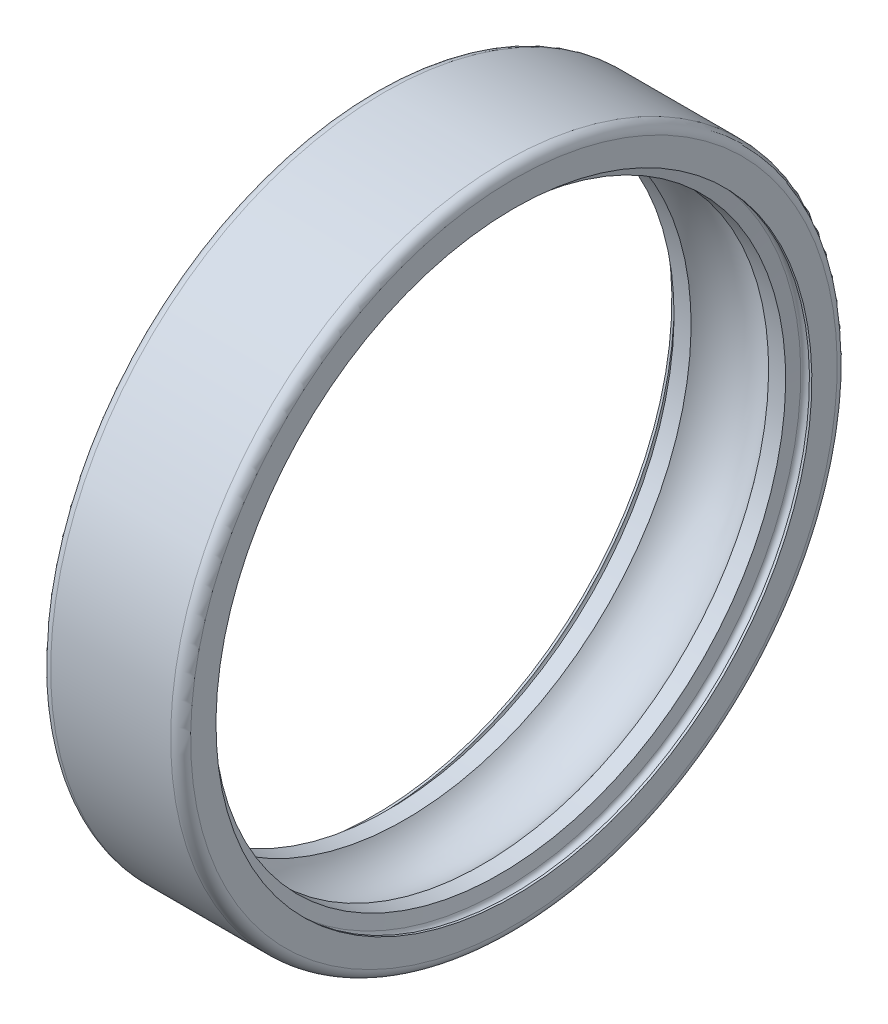
ISO-10303-21;
HEADER;
FILE_DESCRIPTION(('STEP AP214'),'2;1');
FILE_NAME('part.step','',(''),(''),'','','');
FILE_SCHEMA(('AUTOMOTIVE_DESIGN { 1 0 10303 214 1 1 1 1 }'));
ENDSEC;
DATA;
#1=APPLICATION_CONTEXT('core data for automotive mechanical design processes');
#2=APPLICATION_PROTOCOL_DEFINITION('international standard','automotive_design',2000,#1);
#3=PRODUCT_CONTEXT('',#1,'mechanical');
#4=PRODUCT('Part','Part','',(#3));
#5=PRODUCT_RELATED_PRODUCT_CATEGORY('part','',(#4));
#6=PRODUCT_DEFINITION_FORMATION('','',#4);
#7=PRODUCT_DEFINITION_CONTEXT('part definition',#1,'design');
#8=PRODUCT_DEFINITION('design','',#6,#7);
#9=PRODUCT_DEFINITION_SHAPE('','',#8);
#10=(LENGTH_UNIT() NAMED_UNIT(*) SI_UNIT(.MILLI.,.METRE.));
#11=(NAMED_UNIT(*) PLANE_ANGLE_UNIT() SI_UNIT($,.RADIAN.));
#12=(NAMED_UNIT(*) SI_UNIT($,.STERADIAN.) SOLID_ANGLE_UNIT());
#13=UNCERTAINTY_MEASURE_WITH_UNIT(LENGTH_MEASURE(1.E-05),#10,'distance_accuracy_value','');
#14=(GEOMETRIC_REPRESENTATION_CONTEXT(3) GLOBAL_UNCERTAINTY_ASSIGNED_CONTEXT((#13)) GLOBAL_UNIT_ASSIGNED_CONTEXT((#10,
#11,#12)) REPRESENTATION_CONTEXT('',''));
#15=CARTESIAN_POINT('',(0.,0.,0.));
#16=DIRECTION('',(0.,0.,1.));
#17=DIRECTION('',(1.,0.,0.));
#18=AXIS2_PLACEMENT_3D('',#15,#16,#17);
#19=CARTESIAN_POINT('',(19.92,0.,0.));
#20=DIRECTION('',(1.,0.,0.));
#21=DIRECTION('',(0.,0.,-1.));
#22=AXIS2_PLACEMENT_3D('',#19,#20,#21);
#23=TOROIDAL_SURFACE('',#22,44.7,0.72);
#24=CARTESIAN_POINT('',(20.64,0.,0.));
#25=DIRECTION('',(1.,0.,0.));
#26=DIRECTION('',(0.,1.,0.));
#27=AXIS2_PLACEMENT_3D('',#24,#25,#26);
#28=CIRCLE('',#27,44.7);
#29=CARTESIAN_POINT('',(20.64,44.7,0.));
#30=VERTEX_POINT('',#29);
#31=EDGE_CURVE('E11',#30,#30,#28,.T.);
#32=ORIENTED_EDGE('',*,*,#31,.T.);
#33=EDGE_LOOP('',(#32));
#34=FACE_BOUND('',#33,.T.);
#35=CARTESIAN_POINT('',(19.2109384178312,0.,0.));
#36=DIRECTION('',(1.,0.,0.));
#37=DIRECTION('',(0.,1.,0.));
#38=AXIS2_PLACEMENT_3D('',#35,#36,#37);
#39=CIRCLE('',#38,44.8250266879202);
#40=CARTESIAN_POINT('',(19.2109384178312,44.8250266879202,0.));
#41=VERTEX_POINT('',#40);
#42=EDGE_CURVE('E66',#41,#41,#39,.T.);
#43=ORIENTED_EDGE('',*,*,#42,.F.);
#44=EDGE_LOOP('',(#43));
#45=FACE_BOUND('',#44,.T.);
#46=ADVANCED_FACE('F16',(#34,#45),#23,.F.);
#47=CARTESIAN_POINT('',(20.82,0.,0.));
#48=DIRECTION('',(-1.,0.,0.));
#49=DIRECTION('',(0.,1.,0.));
#50=AXIS2_PLACEMENT_3D('',#47,#48,#49);
#51=CYLINDRICAL_SURFACE('',#50,44.7);
#52=CARTESIAN_POINT('',(21.,0.,0.));
#53=DIRECTION('',(1.,0.,0.));
#54=DIRECTION('',(0.,1.,0.));
#55=AXIS2_PLACEMENT_3D('',#52,#53,#54);
#56=CIRCLE('',#55,44.7);
#57=CARTESIAN_POINT('',(21.,44.7,0.));
#58=VERTEX_POINT('',#57);
#59=EDGE_CURVE('E26',#58,#58,#56,.T.);
#60=ORIENTED_EDGE('',*,*,#59,.T.);
#61=EDGE_LOOP('',(#60));
#62=FACE_BOUND('',#61,.T.);
#63=ORIENTED_EDGE('',*,*,#31,.F.);
#64=EDGE_LOOP('',(#63));
#65=FACE_BOUND('',#64,.T.);
#66=ADVANCED_FACE('F106',(#62,#65),#51,.F.);
#67=CARTESIAN_POINT('',(21.,46.6,0.));
#68=DIRECTION('',(1.,0.,0.));
#69=DIRECTION('',(0.,1.,0.));
#70=AXIS2_PLACEMENT_3D('',#67,#68,#69);
#71=PLANE('',#70);
#72=CARTESIAN_POINT('',(21.,0.,0.));
#73=DIRECTION('',(1.,0.,0.));
#74=DIRECTION('',(0.,1.,0.));
#75=AXIS2_PLACEMENT_3D('',#72,#73,#74);
#76=CIRCLE('',#75,48.5);
#77=CARTESIAN_POINT('',(21.,48.5,0.));
#78=VERTEX_POINT('',#77);
#79=EDGE_CURVE('E98',#78,#78,#76,.T.);
#80=ORIENTED_EDGE('',*,*,#79,.T.);
#81=EDGE_LOOP('',(#80));
#82=FACE_BOUND('',#81,.T.);
#83=ORIENTED_EDGE('',*,*,#59,.F.);
#84=EDGE_LOOP('',(#83));
#85=FACE_BOUND('',#84,.T.);
#86=ADVANCED_FACE('F109',(#82,#85),#71,.T.);
#87=CARTESIAN_POINT('',(19.5,0.,0.));
#88=DIRECTION('',(1.,0.,0.));
#89=DIRECTION('',(0.,0.,-1.));
#90=AXIS2_PLACEMENT_3D('',#87,#88,#89);
#91=TOROIDAL_SURFACE('',#90,48.5,1.5);
#92=CARTESIAN_POINT('',(19.5,0.,0.));
#93=DIRECTION('',(1.,0.,0.));
#94=DIRECTION('',(0.,1.,0.));
#95=AXIS2_PLACEMENT_3D('',#92,#93,#94);
#96=CIRCLE('',#95,50.);
#97=CARTESIAN_POINT('',(19.5,50.,0.));
#98=VERTEX_POINT('',#97);
#99=EDGE_CURVE('E96',#98,#98,#96,.T.);
#100=ORIENTED_EDGE('',*,*,#99,.T.);
#101=EDGE_LOOP('',(#100));
#102=FACE_BOUND('',#101,.T.);
#103=ORIENTED_EDGE('',*,*,#79,.F.);
#104=EDGE_LOOP('',(#103));
#105=FACE_BOUND('',#104,.T.);
#106=ADVANCED_FACE('F111',(#102,#105),#91,.T.);
#107=CARTESIAN_POINT('',(10.5,0.,0.));
#108=DIRECTION('',(-1.,0.,0.));
#109=DIRECTION('',(0.,1.,0.));
#110=AXIS2_PLACEMENT_3D('',#107,#108,#109);
#111=CYLINDRICAL_SURFACE('',#110,50.);
#112=CARTESIAN_POINT('',(1.5,0.,0.));
#113=DIRECTION('',(1.,0.,0.));
#114=DIRECTION('',(0.,1.,0.));
#115=AXIS2_PLACEMENT_3D('',#112,#113,#114);
#116=CIRCLE('',#115,50.);
#117=CARTESIAN_POINT('',(1.5,50.,0.));
#118=VERTEX_POINT('',#117);
#119=EDGE_CURVE('E93',#118,#118,#116,.T.);
#120=ORIENTED_EDGE('',*,*,#119,.T.);
#121=EDGE_LOOP('',(#120));
#122=FACE_BOUND('',#121,.T.);
#123=ORIENTED_EDGE('',*,*,#99,.F.);
#124=EDGE_LOOP('',(#123));
#125=FACE_BOUND('',#124,.T.);
#126=ADVANCED_FACE('F119',(#122,#125),#111,.T.);
#127=CARTESIAN_POINT('',(1.5,0.,0.));
#128=DIRECTION('',(1.,0.,0.));
#129=DIRECTION('',(0.,0.,-1.));
#130=AXIS2_PLACEMENT_3D('',#127,#128,#129);
#131=TOROIDAL_SURFACE('',#130,48.5,1.5);
#132=CARTESIAN_POINT('',(0.,0.,0.));
#133=DIRECTION('',(1.,0.,0.));
#134=DIRECTION('',(0.,1.,0.));
#135=AXIS2_PLACEMENT_3D('',#132,#133,#134);
#136=CIRCLE('',#135,48.5);
#137=CARTESIAN_POINT('',(0.,48.5,0.));
#138=VERTEX_POINT('',#137);
#139=EDGE_CURVE('E53',#138,#138,#136,.T.);
#140=ORIENTED_EDGE('',*,*,#139,.T.);
#141=EDGE_LOOP('',(#140));
#142=FACE_BOUND('',#141,.T.);
#143=ORIENTED_EDGE('',*,*,#119,.F.);
#144=EDGE_LOOP('',(#143));
#145=FACE_BOUND('',#144,.T.);
#146=ADVANCED_FACE('F142',(#142,#145),#131,.T.);
#147=CARTESIAN_POINT('',(0.,46.6,0.));
#148=DIRECTION('',(-1.,0.,0.));
#149=DIRECTION('',(0.,-1.,0.));
#150=AXIS2_PLACEMENT_3D('',#147,#148,#149);
#151=PLANE('',#150);
#152=CARTESIAN_POINT('',(0.,0.,0.));
#153=DIRECTION('',(1.,0.,0.));
#154=DIRECTION('',(0.,1.,0.));
#155=AXIS2_PLACEMENT_3D('',#152,#153,#154);
#156=CIRCLE('',#155,44.7);
#157=CARTESIAN_POINT('',(0.,44.7,0.));
#158=VERTEX_POINT('',#157);
#159=EDGE_CURVE('E58',#158,#158,#156,.T.);
#160=ORIENTED_EDGE('',*,*,#159,.T.);
#161=EDGE_LOOP('',(#160));
#162=FACE_BOUND('',#161,.T.);
#163=ORIENTED_EDGE('',*,*,#139,.F.);
#164=EDGE_LOOP('',(#163));
#165=FACE_BOUND('',#164,.T.);
#166=ADVANCED_FACE('F133',(#162,#165),#151,.T.);
#167=CARTESIAN_POINT('',(0.18,0.,0.));
#168=DIRECTION('',(-1.,0.,0.));
#169=DIRECTION('',(0.,1.,0.));
#170=AXIS2_PLACEMENT_3D('',#167,#168,#169);
#171=CYLINDRICAL_SURFACE('',#170,44.7);
#172=CARTESIAN_POINT('',(0.36,0.,0.));
#173=DIRECTION('',(1.,0.,0.));
#174=DIRECTION('',(0.,1.,0.));
#175=AXIS2_PLACEMENT_3D('',#172,#173,#174);
#176=CIRCLE('',#175,44.7);
#177=CARTESIAN_POINT('',(0.36,44.7,0.));
#178=VERTEX_POINT('',#177);
#179=EDGE_CURVE('E20',#178,#178,#176,.T.);
#180=ORIENTED_EDGE('',*,*,#179,.T.);
#181=EDGE_LOOP('',(#180));
#182=FACE_BOUND('',#181,.T.);
#183=ORIENTED_EDGE('',*,*,#159,.F.);
#184=EDGE_LOOP('',(#183));
#185=FACE_BOUND('',#184,.T.);
#186=ADVANCED_FACE('F129',(#182,#185),#171,.F.);
#187=CARTESIAN_POINT('',(1.08,0.,0.));
#188=DIRECTION('',(1.,0.,0.));
#189=DIRECTION('',(0.,0.,-1.));
#190=AXIS2_PLACEMENT_3D('',#187,#188,#189);
#191=TOROIDAL_SURFACE('',#190,44.7,0.72);
#192=CARTESIAN_POINT('',(1.7890615821688,0.,0.));
#193=DIRECTION('',(1.,0.,0.));
#194=DIRECTION('',(0.,1.,0.));
#195=AXIS2_PLACEMENT_3D('',#192,#193,#194);
#196=CIRCLE('',#195,44.8250266879202);
#197=CARTESIAN_POINT('',(1.7890615821688,44.8250266879202,0.));
#198=VERTEX_POINT('',#197);
#199=EDGE_CURVE('E78',#198,#198,#196,.T.);
#200=ORIENTED_EDGE('',*,*,#199,.T.);
#201=EDGE_LOOP('',(#200));
#202=FACE_BOUND('',#201,.T.);
#203=ORIENTED_EDGE('',*,*,#179,.F.);
#204=EDGE_LOOP('',(#203));
#205=FACE_BOUND('',#204,.T.);
#206=ADVANCED_FACE('F132',(#202,#205),#191,.F.);
#207=CARTESIAN_POINT('',(1.95877865400089,0.,0.));
#208=DIRECTION('',(-1.,0.,0.));
#209=DIRECTION('',(0.,1.,0.));
#210=AXIS2_PLACEMENT_3D('',#207,#208,#209);
#211=CONICAL_SURFACE('',#210,43.8625133439601,1.39626340159546);
#212=CARTESIAN_POINT('',(2.12849572583298,0.,0.));
#213=DIRECTION('',(1.,0.,0.));
#214=DIRECTION('',(0.,1.,0.));
#215=AXIS2_PLACEMENT_3D('',#212,#213,#214);
#216=CIRCLE('',#215,42.9);
#217=CARTESIAN_POINT('',(2.12849572583298,42.9,0.));
#218=VERTEX_POINT('',#217);
#219=EDGE_CURVE('E82',#218,#218,#216,.T.);
#220=ORIENTED_EDGE('',*,*,#219,.T.);
#221=EDGE_LOOP('',(#220));
#222=FACE_BOUND('',#221,.T.);
#223=ORIENTED_EDGE('',*,*,#199,.F.);
#224=EDGE_LOOP('',(#223));
#225=FACE_BOUND('',#224,.T.);
#226=ADVANCED_FACE('F83',(#222,#225),#211,.F.);
#227=CARTESIAN_POINT('',(3.40674739000165,0.,0.));
#228=DIRECTION('',(-1.,0.,0.));
#229=DIRECTION('',(0.,1.,0.));
#230=AXIS2_PLACEMENT_3D('',#227,#228,#229);
#231=CYLINDRICAL_SURFACE('',#230,42.9);
#232=CARTESIAN_POINT('',(4.68499905417032,0.,0.));
#233=DIRECTION('',(1.,0.,0.));
#234=DIRECTION('',(0.,1.,0.));
#235=AXIS2_PLACEMENT_3D('',#232,#233,#234);
#236=CIRCLE('',#235,42.9);
#237=CARTESIAN_POINT('',(4.68499905417032,42.9,0.));
#238=VERTEX_POINT('',#237);
#239=EDGE_CURVE('E86',#238,#238,#236,.T.);
#240=ORIENTED_EDGE('',*,*,#239,.T.);
#241=EDGE_LOOP('',(#240));
#242=FACE_BOUND('',#241,.T.);
#243=ORIENTED_EDGE('',*,*,#219,.F.);
#244=EDGE_LOOP('',(#243));
#245=FACE_BOUND('',#244,.T.);
#246=ADVANCED_FACE('F141',(#242,#245),#231,.F.);
#247=CARTESIAN_POINT('',(10.5,0.,0.));
#248=DIRECTION('',(1.,0.,0.));
#249=DIRECTION('',(0.,0.,-1.));
#250=AXIS2_PLACEMENT_3D('',#247,#248,#249);
#251=TOROIDAL_SURFACE('',#250,38.75,7.144);
#252=CARTESIAN_POINT('',(16.3150009458297,0.,0.));
#253=DIRECTION('',(1.,0.,0.));
#254=DIRECTION('',(0.,1.,0.));
#255=AXIS2_PLACEMENT_3D('',#252,#253,#254);
#256=CIRCLE('',#255,42.9);
#257=CARTESIAN_POINT('',(16.3150009458297,42.9,0.));
#258=VERTEX_POINT('',#257);
#259=EDGE_CURVE('E89',#258,#258,#256,.T.);
#260=ORIENTED_EDGE('',*,*,#259,.T.);
#261=EDGE_LOOP('',(#260));
#262=FACE_BOUND('',#261,.T.);
#263=ORIENTED_EDGE('',*,*,#239,.F.);
#264=EDGE_LOOP('',(#263));
#265=FACE_BOUND('',#264,.T.);
#266=ADVANCED_FACE('F18',(#262,#265),#251,.F.);
#267=CARTESIAN_POINT('',(17.5932526099984,0.,0.));
#268=DIRECTION('',(-1.,0.,0.));
#269=DIRECTION('',(0.,1.,0.));
#270=AXIS2_PLACEMENT_3D('',#267,#268,#269);
#271=CYLINDRICAL_SURFACE('',#270,42.9);
#272=CARTESIAN_POINT('',(18.871504274167,0.,0.));
#273=DIRECTION('',(1.,0.,0.));
#274=DIRECTION('',(0.,1.,0.));
#275=AXIS2_PLACEMENT_3D('',#272,#273,#274);
#276=CIRCLE('',#275,42.9);
#277=CARTESIAN_POINT('',(18.871504274167,42.9,0.));
#278=VERTEX_POINT('',#277);
#279=EDGE_CURVE('E73',#278,#278,#276,.T.);
#280=ORIENTED_EDGE('',*,*,#279,.T.);
#281=EDGE_LOOP('',(#280));
#282=FACE_BOUND('',#281,.T.);
#283=ORIENTED_EDGE('',*,*,#259,.F.);
#284=EDGE_LOOP('',(#283));
#285=FACE_BOUND('',#284,.T.);
#286=ADVANCED_FACE('F138',(#282,#285),#271,.F.);
#287=CARTESIAN_POINT('',(19.0412213459991,0.,0.));
#288=DIRECTION('',(1.,0.,0.));
#289=DIRECTION('',(0.,1.,0.));
#290=AXIS2_PLACEMENT_3D('',#287,#288,#289);
#291=CONICAL_SURFACE('',#290,43.8625133439601,1.39626340159546);
#292=ORIENTED_EDGE('',*,*,#42,.T.);
#293=EDGE_LOOP('',(#292));
#294=FACE_BOUND('',#293,.T.);
#295=ORIENTED_EDGE('',*,*,#279,.F.);
#296=EDGE_LOOP('',(#295));
#297=FACE_BOUND('',#296,.T.);
#298=ADVANCED_FACE('F135',(#294,#297),#291,.F.);
#299=CLOSED_SHELL('',(#46,#66,#86,#106,#126,#146,#166,#186,#206,#226,#246,#266,#286,#298));
#300=MANIFOLD_SOLID_BREP('B1',#299);
#301=ADVANCED_BREP_SHAPE_REPRESENTATION('',(#18,#300),#14);
#302=SHAPE_DEFINITION_REPRESENTATION(#9,#301);
ENDSEC;
END-ISO-10303-21;
